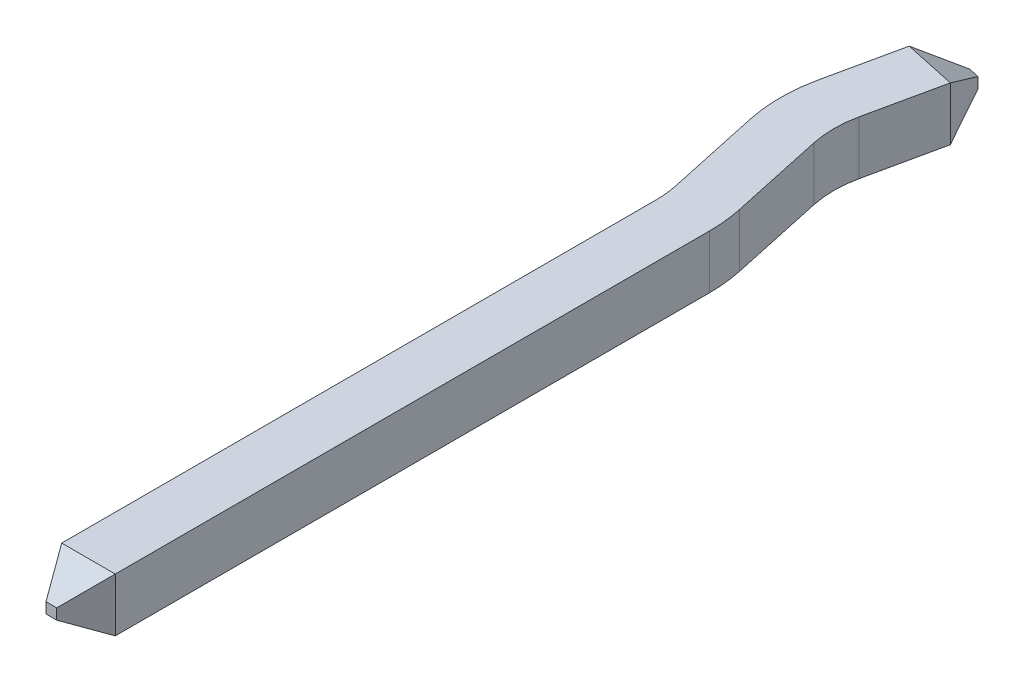
ISO-10303-21;
HEADER;
FILE_DESCRIPTION(('STEP AP214'),'2;1');
FILE_NAME('part.step','',(''),(''),'','','');
FILE_SCHEMA(('AUTOMOTIVE_DESIGN { 1 0 10303 214 1 1 1 1 }'));
ENDSEC;
DATA;
#1=APPLICATION_CONTEXT('core data for automotive mechanical design processes');
#2=APPLICATION_PROTOCOL_DEFINITION('international standard','automotive_design',2000,#1);
#3=PRODUCT_CONTEXT('',#1,'mechanical');
#4=PRODUCT('Part','Part','',(#3));
#5=PRODUCT_RELATED_PRODUCT_CATEGORY('part','',(#4));
#6=PRODUCT_DEFINITION_FORMATION('','',#4);
#7=PRODUCT_DEFINITION_CONTEXT('part definition',#1,'design');
#8=PRODUCT_DEFINITION('design','',#6,#7);
#9=PRODUCT_DEFINITION_SHAPE('','',#8);
#10=(LENGTH_UNIT() NAMED_UNIT(*) SI_UNIT(.MILLI.,.METRE.));
#11=(NAMED_UNIT(*) PLANE_ANGLE_UNIT() SI_UNIT($,.RADIAN.));
#12=(NAMED_UNIT(*) SI_UNIT($,.STERADIAN.) SOLID_ANGLE_UNIT());
#13=UNCERTAINTY_MEASURE_WITH_UNIT(LENGTH_MEASURE(1.E-05),#10,'distance_accuracy_value','');
#14=(GEOMETRIC_REPRESENTATION_CONTEXT(3) GLOBAL_UNCERTAINTY_ASSIGNED_CONTEXT((#13)) GLOBAL_UNIT_ASSIGNED_CONTEXT((#10,
#11,#12)) REPRESENTATION_CONTEXT('',''));
#15=CARTESIAN_POINT('',(0.,0.,0.));
#16=DIRECTION('',(0.,0.,1.));
#17=DIRECTION('',(1.,0.,0.));
#18=AXIS2_PLACEMENT_3D('',#15,#16,#17);
#19=CARTESIAN_POINT('',(-0.3,0.25,6.05));
#20=DIRECTION('',(-0.866025403784329,0.,0.50000000000019));
#21=DIRECTION('',(0.,1.,0.));
#22=AXIS2_PLACEMENT_3D('',#19,#20,#21);
#23=PLANE('',#22);
#24=DIRECTION('',(0.44721359550015,-0.44721359550015,0.774596669241261));
#25=VECTOR('',#24,1.);
#26=CARTESIAN_POINT('',(-0.24,-0.01,6.153923048454));
#27=LINE('',#26,#25);
#28=CARTESIAN_POINT('',(-0.5,0.25,5.703589838486));
#29=VERTEX_POINT('',#28);
#30=CARTESIAN_POINT('',(-0.3,0.05,6.05));
#31=VERTEX_POINT('',#30);
#32=EDGE_CURVE('E28',#29,#31,#27,.T.);
#33=ORIENTED_EDGE('',*,*,#32,.F.);
#34=DIRECTION('',(0.,1.,0.));
#35=VECTOR('',#34,1.);
#36=CARTESIAN_POINT('',(-0.5,0.25,5.703589838486));
#37=LINE('',#36,#35);
#38=CARTESIAN_POINT('',(-0.5,-0.25,5.703589838486));
#39=VERTEX_POINT('',#38);
#40=EDGE_CURVE('E209',#39,#29,#37,.T.);
#41=ORIENTED_EDGE('',*,*,#40,.F.);
#42=DIRECTION('',(0.44721359550015,0.44721359550015,0.774596669241261));
#43=VECTOR('',#42,1.);
#44=CARTESIAN_POINT('',(-0.4,-0.15,5.876794919243));
#45=LINE('',#44,#43);
#46=CARTESIAN_POINT('',(-0.3,-0.05,6.05));
#47=VERTEX_POINT('',#46);
#48=EDGE_CURVE('E11',#39,#47,#45,.T.);
#49=ORIENTED_EDGE('',*,*,#48,.T.);
#50=DIRECTION('',(0.,1.,0.));
#51=VECTOR('',#50,1.);
#52=CARTESIAN_POINT('',(-0.3,0.25,6.05));
#53=LINE('',#52,#51);
#54=EDGE_CURVE('E239',#47,#31,#53,.T.);
#55=ORIENTED_EDGE('',*,*,#54,.T.);
#56=EDGE_LOOP('',(#33,#41,#49,#55));
#57=FACE_BOUND('',#56,.T.);
#58=ADVANCED_FACE('F17',(#57),#23,.T.);
#59=CARTESIAN_POINT('',(0.,-0.25,5.703589838486));
#60=DIRECTION('',(0.,0.866025403784329,-0.50000000000019));
#61=DIRECTION('',(-1.,0.,0.));
#62=AXIS2_PLACEMENT_3D('',#59,#60,#61);
#63=PLANE('',#62);
#64=DIRECTION('',(-0.44721359550015,0.44721359550015,0.774596669241261));
#65=VECTOR('',#64,1.);
#66=CARTESIAN_POINT('',(0.,-0.25,5.703589838486));
#67=LINE('',#66,#65);
#68=CARTESIAN_POINT('',(0.,-0.25,5.703589838486));
#69=VERTEX_POINT('',#68);
#70=CARTESIAN_POINT('',(-0.2,-0.05,6.05));
#71=VERTEX_POINT('',#70);
#72=EDGE_CURVE('E42',#69,#71,#67,.T.);
#73=ORIENTED_EDGE('',*,*,#72,.T.);
#74=DIRECTION('',(-1.,0.,0.));
#75=VECTOR('',#74,1.);
#76=CARTESIAN_POINT('',(0.,-0.05,6.05));
#77=LINE('',#76,#75);
#78=EDGE_CURVE('E260',#71,#47,#77,.T.);
#79=ORIENTED_EDGE('',*,*,#78,.T.);
#80=ORIENTED_EDGE('',*,*,#48,.F.);
#81=DIRECTION('',(1.,0.,0.));
#82=VECTOR('',#81,1.);
#83=CARTESIAN_POINT('',(0.,-0.25,5.703589838486));
#84=LINE('',#83,#82);
#85=EDGE_CURVE('E246',#39,#69,#84,.T.);
#86=ORIENTED_EDGE('',*,*,#85,.T.);
#87=EDGE_LOOP('',(#73,#79,#80,#86));
#88=FACE_BOUND('',#87,.T.);
#89=ADVANCED_FACE('F395',(#88),#63,.F.);
#90=CARTESIAN_POINT('',(0.,0.05,6.05));
#91=DIRECTION('',(0.,0.866025403784329,0.50000000000019));
#92=DIRECTION('',(1.,0.,0.));
#93=AXIS2_PLACEMENT_3D('',#90,#91,#92);
#94=PLANE('',#93);
#95=DIRECTION('',(0.44721359550015,0.44721359550015,-0.774596669241261));
#96=VECTOR('',#95,1.);
#97=CARTESIAN_POINT('',(0.,0.25,5.703589838486));
#98=LINE('',#97,#96);
#99=CARTESIAN_POINT('',(-0.2,0.05,6.05));
#100=VERTEX_POINT('',#99);
#101=CARTESIAN_POINT('',(0.,0.25,5.703589838486));
#102=VERTEX_POINT('',#101);
#103=EDGE_CURVE('E228',#100,#102,#98,.T.);
#104=ORIENTED_EDGE('',*,*,#103,.T.);
#105=DIRECTION('',(1.,0.,0.));
#106=VECTOR('',#105,1.);
#107=CARTESIAN_POINT('',(-0.27,0.25,5.703589838486));
#108=LINE('',#107,#106);
#109=EDGE_CURVE('E302',#29,#102,#108,.T.);
#110=ORIENTED_EDGE('',*,*,#109,.F.);
#111=ORIENTED_EDGE('',*,*,#32,.T.);
#112=DIRECTION('',(1.,0.,0.));
#113=VECTOR('',#112,1.);
#114=CARTESIAN_POINT('',(0.,0.05,6.05));
#115=LINE('',#114,#113);
#116=EDGE_CURVE('E236',#31,#100,#115,.T.);
#117=ORIENTED_EDGE('',*,*,#116,.T.);
#118=EDGE_LOOP('',(#104,#110,#111,#117));
#119=FACE_BOUND('',#118,.T.);
#120=ADVANCED_FACE('F391',(#119),#94,.T.);
#121=CARTESIAN_POINT('',(0.,0.25,5.703589838486));
#122=DIRECTION('',(-0.866025403784329,0.,-0.50000000000019));
#123=DIRECTION('',(-0.50000000000019,0.,0.866025403784329));
#124=AXIS2_PLACEMENT_3D('',#121,#122,#123);
#125=PLANE('',#124);
#126=ORIENTED_EDGE('',*,*,#72,.F.);
#127=DIRECTION('',(0.,-1.,0.));
#128=VECTOR('',#127,1.);
#129=CARTESIAN_POINT('',(0.,-0.25,5.703589838486));
#130=LINE('',#129,#128);
#131=EDGE_CURVE('E208',#102,#69,#130,.T.);
#132=ORIENTED_EDGE('',*,*,#131,.F.);
#133=ORIENTED_EDGE('',*,*,#103,.F.);
#134=DIRECTION('',(0.,-1.,0.));
#135=VECTOR('',#134,1.);
#136=CARTESIAN_POINT('',(-0.2,0.25,6.05));
#137=LINE('',#136,#135);
#138=EDGE_CURVE('E214',#100,#71,#137,.T.);
#139=ORIENTED_EDGE('',*,*,#138,.T.);
#140=EDGE_LOOP('',(#126,#132,#133,#139));
#141=FACE_BOUND('',#140,.T.);
#142=ADVANCED_FACE('F382',(#141),#125,.F.);
#143=CARTESIAN_POINT('',(-0.195491559873,0.25,-2.542226176933));
#144=DIRECTION('',(0.952068727709821,0.,-0.305884190040943));
#145=DIRECTION('',(0.,-1.,0.));
#146=AXIS2_PLACEMENT_3D('',#143,#144,#145);
#147=PLANE('',#146);
#148=DIRECTION('',(0.273591136870049,0.44721359550008,0.851556157764152));
#149=VECTOR('',#148,1.);
#150=CARTESIAN_POINT('',(-0.07313788385667,0.25,-2.161398685849));
#151=LINE('',#150,#149);
#152=CARTESIAN_POINT('',(-0.195491559873,0.05,-2.542226176933));
#153=VERTEX_POINT('',#152);
#154=CARTESIAN_POINT('',(-0.07313788385667,0.25,-2.161398685849));
#155=VERTEX_POINT('',#154);
#156=EDGE_CURVE('E227',#153,#155,#151,.T.);
#157=ORIENTED_EDGE('',*,*,#156,.T.);
#158=DIRECTION('',(0.,1.,0.));
#159=VECTOR('',#158,1.);
#160=CARTESIAN_POINT('',(-0.07313788385667,0.25,-2.161398685849));
#161=LINE('',#160,#159);
#162=CARTESIAN_POINT('',(-0.07313788385668,-0.25,-2.161398685849));
#163=VERTEX_POINT('',#162);
#164=EDGE_CURVE('E198',#163,#155,#161,.T.);
#165=ORIENTED_EDGE('',*,*,#164,.F.);
#166=DIRECTION('',(0.273591136870049,-0.44721359550008,0.851556157764152));
#167=VECTOR('',#166,1.);
#168=CARTESIAN_POINT('',(-0.17102082467,-0.09,-2.466060678716));
#169=LINE('',#168,#167);
#170=CARTESIAN_POINT('',(-0.195491559873,-0.05,-2.542226176933));
#171=VERTEX_POINT('',#170);
#172=EDGE_CURVE('E224',#171,#163,#169,.T.);
#173=ORIENTED_EDGE('',*,*,#172,.F.);
#174=DIRECTION('',(0.,-1.,0.));
#175=VECTOR('',#174,1.);
#176=CARTESIAN_POINT('',(-0.195491559873,-0.25,-2.542226176933));
#177=LINE('',#176,#175);
#178=EDGE_CURVE('E267',#153,#171,#177,.T.);
#179=ORIENTED_EDGE('',*,*,#178,.F.);
#180=EDGE_LOOP('',(#157,#165,#173,#179));
#181=FACE_BOUND('',#180,.T.);
#182=ADVANCED_FACE('F409',(#181),#147,.T.);
#183=CARTESIAN_POINT('',(0.,-0.05,-2.5));
#184=DIRECTION('',(0.105565442332034,-0.866025403784283,-0.48872889968316));
#185=DIRECTION('',(0.,0.49147508660748,-0.870891634616024));
#186=AXIS2_PLACEMENT_3D('',#183,#184,#185);
#187=PLANE('',#186);
#188=DIRECTION('',(-0.600673696937871,-0.447213595499904,0.662714953661858));
#189=VECTOR('',#188,1.);
#190=CARTESIAN_POINT('',(-0.212648506691,0.009999999999999,-2.652251806565));
#191=LINE('',#190,#189);
#192=CARTESIAN_POINT('',(-0.29323733981,-0.05,-2.563339265399));
#193=VERTEX_POINT('',#192);
#194=CARTESIAN_POINT('',(-0.56186678354,-0.25,-2.26696412818));
#195=VERTEX_POINT('',#194);
#196=EDGE_CURVE('E279',#193,#195,#191,.T.);
#197=ORIENTED_EDGE('',*,*,#196,.F.);
#198=DIRECTION('',(-0.977457799365998,0.,-0.211130884663));
#199=VECTOR('',#198,1.);
#200=CARTESIAN_POINT('',(0.,-0.05,-2.5));
#201=LINE('',#200,#199);
#202=EDGE_CURVE('E286',#171,#193,#201,.T.);
#203=ORIENTED_EDGE('',*,*,#202,.F.);
#204=ORIENTED_EDGE('',*,*,#172,.T.);
#205=DIRECTION('',(-0.977457799365998,0.,-0.211130884663));
#206=VECTOR('',#205,1.);
#207=CARTESIAN_POINT('',(1.691338696796,-0.25,-1.780271744428));
#208=LINE('',#207,#206);
#209=EDGE_CURVE('E194',#163,#195,#208,.T.);
#210=ORIENTED_EDGE('',*,*,#209,.T.);
#211=EDGE_LOOP('',(#197,#203,#204,#210));
#212=FACE_BOUND('',#211,.T.);
#213=ADVANCED_FACE('F412',(#212),#187,.T.);
#214=CARTESIAN_POINT('',(-0.07313788385667,0.25,-2.161398685849));
#215=DIRECTION('',(-0.105565442332034,-0.866025403784283,0.48872889968316));
#216=DIRECTION('',(-0.992652406325069,0.121000827340356,0.));
#217=AXIS2_PLACEMENT_3D('',#214,#215,#216);
#218=PLANE('',#217);
#219=DIRECTION('',(-0.600673696937871,0.447213595499904,0.662714953661858));
#220=VECTOR('',#219,1.);
#221=CARTESIAN_POINT('',(-0.427552061675,0.15,-2.41515169679));
#222=LINE('',#221,#220);
#223=CARTESIAN_POINT('',(-0.29323733981,0.05,-2.563339265399));
#224=VERTEX_POINT('',#223);
#225=CARTESIAN_POINT('',(-0.56186678354,0.25,-2.26696412818));
#226=VERTEX_POINT('',#225);
#227=EDGE_CURVE('E282',#224,#226,#222,.T.);
#228=ORIENTED_EDGE('',*,*,#227,.T.);
#229=DIRECTION('',(-0.977457799365998,0.,-0.211130884663));
#230=VECTOR('',#229,1.);
#231=CARTESIAN_POINT('',(-0.07313788385667,0.25,-2.161398685849));
#232=LINE('',#231,#230);
#233=EDGE_CURVE('E219',#155,#226,#232,.T.);
#234=ORIENTED_EDGE('',*,*,#233,.F.);
#235=ORIENTED_EDGE('',*,*,#156,.F.);
#236=DIRECTION('',(0.977457799365998,0.,0.211130884663));
#237=VECTOR('',#236,1.);
#238=CARTESIAN_POINT('',(0.,0.05,-2.5));
#239=LINE('',#238,#237);
#240=EDGE_CURVE('E263',#224,#153,#239,.T.);
#241=ORIENTED_EDGE('',*,*,#240,.F.);
#242=EDGE_LOOP('',(#228,#234,#235,#241));
#243=FACE_BOUND('',#242,.T.);
#244=ADVANCED_FACE('F424',(#243),#218,.F.);
#245=CARTESIAN_POINT('',(-0.56186678354,0.25,-2.26696412818));
#246=DIRECTION('',(0.740937843046649,0.,0.671573609324682));
#247=DIRECTION('',(0.,-1.,0.));
#248=AXIS2_PLACEMENT_3D('',#245,#246,#247);
#249=PLANE('',#248);
#250=ORIENTED_EDGE('',*,*,#196,.T.);
#251=DIRECTION('',(0.,-1.,0.));
#252=VECTOR('',#251,1.);
#253=CARTESIAN_POINT('',(-0.56186678354,0.25,-2.26696412818));
#254=LINE('',#253,#252);
#255=EDGE_CURVE('E272',#226,#195,#254,.T.);
#256=ORIENTED_EDGE('',*,*,#255,.F.);
#257=ORIENTED_EDGE('',*,*,#227,.F.);
#258=DIRECTION('',(0.,1.,0.));
#259=VECTOR('',#258,1.);
#260=CARTESIAN_POINT('',(-0.29323733981,0.25,-2.563339265399));
#261=LINE('',#260,#259);
#262=EDGE_CURVE('E268',#193,#224,#261,.T.);
#263=ORIENTED_EDGE('',*,*,#262,.F.);
#264=EDGE_LOOP('',(#250,#256,#257,#263));
#265=FACE_BOUND('',#264,.T.);
#266=ADVANCED_FACE('F421',(#265),#249,.F.);
#267=CARTESIAN_POINT('',(-0.27,0.25,-1.25));
#268=DIRECTION('',(-0.977457799365998,0.,-0.211130884663));
#269=DIRECTION('',(-0.211130884663,0.,0.977457799365998));
#270=AXIS2_PLACEMENT_3D('',#267,#268,#269);
#271=PLANE('',#270);
#272=DIRECTION('',(0.211130884663,0.,-0.977457799365998));
#273=VECTOR('',#272,1.);
#274=CARTESIAN_POINT('',(-0.27,-0.25,-1.25));
#275=LINE('',#274,#273);
#276=CARTESIAN_POINT('',(-0.224395728913,-0.25,-1.461130884663));
#277=VERTEX_POINT('',#276);
#278=EDGE_CURVE('E188',#277,#163,#275,.T.);
#279=ORIENTED_EDGE('',*,*,#278,.T.);
#280=ORIENTED_EDGE('',*,*,#164,.T.);
#281=DIRECTION('',(0.211130884663,0.,-0.977457799365998));
#282=VECTOR('',#281,1.);
#283=CARTESIAN_POINT('',(-0.27,0.25,-1.25));
#284=LINE('',#283,#282);
#285=CARTESIAN_POINT('',(-0.224395728913,0.25,-1.461130884663));
#286=VERTEX_POINT('',#285);
#287=EDGE_CURVE('E215',#286,#155,#284,.T.);
#288=ORIENTED_EDGE('',*,*,#287,.F.);
#289=DIRECTION('',(0.,-1.,0.));
#290=VECTOR('',#289,1.);
#291=CARTESIAN_POINT('',(-0.224395728913,0.25,-1.461130884663));
#292=LINE('',#291,#290);
#293=EDGE_CURVE('E174',#286,#277,#292,.T.);
#294=ORIENTED_EDGE('',*,*,#293,.T.);
#295=EDGE_LOOP('',(#279,#280,#288,#294));
#296=FACE_BOUND('',#295,.T.);
#297=ADVANCED_FACE('F423',(#296),#271,.F.);
#298=CARTESIAN_POINT('',(0.753062070453,0.25,-1.25));
#299=DIRECTION('',(0.,-1.,0.));
#300=DIRECTION('',(0.,0.,-1.));
#301=AXIS2_PLACEMENT_3D('',#298,#299,#300);
#302=CYLINDRICAL_SURFACE('',#301,1.);
#303=CARTESIAN_POINT('',(0.753062070453,-0.25,-1.25));
#304=DIRECTION('',(0.,1.,0.));
#305=DIRECTION('',(0.,0.,1.));
#306=AXIS2_PLACEMENT_3D('',#303,#304,#305);
#307=CIRCLE('',#306,1.);
#308=CARTESIAN_POINT('',(-0.224395728913,-0.25,-1.038869115337));
#309=VERTEX_POINT('',#308);
#310=EDGE_CURVE('E168',#277,#309,#307,.T.);
#311=ORIENTED_EDGE('',*,*,#310,.F.);
#312=ORIENTED_EDGE('',*,*,#293,.F.);
#313=CARTESIAN_POINT('',(0.753062070453,0.25,-1.25));
#314=DIRECTION('',(0.,1.,0.));
#315=DIRECTION('',(0.,0.,1.));
#316=AXIS2_PLACEMENT_3D('',#313,#314,#315);
#317=CIRCLE('',#316,1.);
#318=CARTESIAN_POINT('',(-0.224395728913,0.25,-1.038869115337));
#319=VERTEX_POINT('',#318);
#320=EDGE_CURVE('E171',#286,#319,#317,.T.);
#321=ORIENTED_EDGE('',*,*,#320,.T.);
#322=DIRECTION('',(0.,-1.,0.));
#323=VECTOR('',#322,1.);
#324=CARTESIAN_POINT('',(-0.224395728913,0.25,-1.038869115337));
#325=LINE('',#324,#323);
#326=EDGE_CURVE('E92',#319,#309,#325,.T.);
#327=ORIENTED_EDGE('',*,*,#326,.T.);
#328=EDGE_LOOP('',(#311,#312,#321,#327));
#329=FACE_BOUND('',#328,.T.);
#330=ADVANCED_FACE('F166',(#329),#302,.F.);
#331=CARTESIAN_POINT('',(0.,0.25,0.));
#332=DIRECTION('',(-0.977457799365998,0.,0.211130884663));
#333=DIRECTION('',(0.,1.,0.));
#334=AXIS2_PLACEMENT_3D('',#331,#332,#333);
#335=PLANE('',#334);
#336=DIRECTION('',(-0.211130884663,0.,-0.977457799365998));
#337=VECTOR('',#336,1.);
#338=CARTESIAN_POINT('',(0.,-0.25,0.));
#339=LINE('',#338,#337);
#340=CARTESIAN_POINT('',(-0.03381330095102,-0.25,-0.156543059958));
#341=VERTEX_POINT('',#340);
#342=EDGE_CURVE('E177',#341,#309,#339,.T.);
#343=ORIENTED_EDGE('',*,*,#342,.T.);
#344=ORIENTED_EDGE('',*,*,#326,.F.);
#345=DIRECTION('',(-0.211130884663,0.,-0.977457799365998));
#346=VECTOR('',#345,1.);
#347=CARTESIAN_POINT('',(0.,0.25,0.));
#348=LINE('',#347,#346);
#349=CARTESIAN_POINT('',(-0.03381330095102,0.25,-0.156543059958));
#350=VERTEX_POINT('',#349);
#351=EDGE_CURVE('E295',#350,#319,#348,.T.);
#352=ORIENTED_EDGE('',*,*,#351,.F.);
#353=DIRECTION('',(0.,-1.,0.));
#354=VECTOR('',#353,1.);
#355=CARTESIAN_POINT('',(-0.03381330095102,0.25,-0.156543059958));
#356=LINE('',#355,#354);
#357=EDGE_CURVE('E108',#350,#341,#356,.T.);
#358=ORIENTED_EDGE('',*,*,#357,.T.);
#359=EDGE_LOOP('',(#343,#344,#352,#358));
#360=FACE_BOUND('',#359,.T.);
#361=ADVANCED_FACE('F178',(#360),#335,.F.);
#362=CARTESIAN_POINT('',(-1.5,0.25,0.160153267036));
#363=DIRECTION('',(0.,-1.,0.));
#364=DIRECTION('',(0.,0.,-1.));
#365=AXIS2_PLACEMENT_3D('',#362,#363,#364);
#366=CYLINDRICAL_SURFACE('',#365,1.5);
#367=CARTESIAN_POINT('',(-1.5,-0.25,0.160153267036));
#368=DIRECTION('',(0.,-1.,0.));
#369=DIRECTION('',(0.,0.,-1.));
#370=AXIS2_PLACEMENT_3D('',#367,#368,#369);
#371=CIRCLE('',#370,1.5);
#372=CARTESIAN_POINT('',(0.,-0.25,0.160153267036));
#373=VERTEX_POINT('',#372);
#374=EDGE_CURVE('E182',#341,#373,#371,.T.);
#375=ORIENTED_EDGE('',*,*,#374,.F.);
#376=ORIENTED_EDGE('',*,*,#357,.F.);
#377=CARTESIAN_POINT('',(-1.5,0.25,0.160153267036));
#378=DIRECTION('',(0.,-1.,0.));
#379=DIRECTION('',(0.,0.,-1.));
#380=AXIS2_PLACEMENT_3D('',#377,#378,#379);
#381=CIRCLE('',#380,1.5);
#382=CARTESIAN_POINT('',(0.,0.25,0.160153267036));
#383=VERTEX_POINT('',#382);
#384=EDGE_CURVE('E21',#350,#383,#381,.T.);
#385=ORIENTED_EDGE('',*,*,#384,.T.);
#386=DIRECTION('',(0.,-1.,0.));
#387=VECTOR('',#386,1.);
#388=CARTESIAN_POINT('',(0.,0.25,0.160153267036));
#389=LINE('',#388,#387);
#390=EDGE_CURVE('E205',#383,#373,#389,.T.);
#391=ORIENTED_EDGE('',*,*,#390,.T.);
#392=EDGE_LOOP('',(#375,#376,#385,#391));
#393=FACE_BOUND('',#392,.T.);
#394=ADVANCED_FACE('F477',(#393),#366,.T.);
#395=CARTESIAN_POINT('',(0.,0.25,6.05));
#396=DIRECTION('',(-1.,0.,0.));
#397=DIRECTION('',(0.,1.,0.));
#398=AXIS2_PLACEMENT_3D('',#395,#396,#397);
#399=PLANE('',#398);
#400=DIRECTION('',(0.,0.,-1.));
#401=VECTOR('',#400,1.);
#402=CARTESIAN_POINT('',(0.,0.25,6.05));
#403=LINE('',#402,#401);
#404=EDGE_CURVE('E315',#102,#383,#403,.T.);
#405=ORIENTED_EDGE('',*,*,#404,.F.);
#406=ORIENTED_EDGE('',*,*,#131,.T.);
#407=DIRECTION('',(0.,0.,-1.));
#408=VECTOR('',#407,1.);
#409=CARTESIAN_POINT('',(0.,-0.25,6.05));
#410=LINE('',#409,#408);
#411=EDGE_CURVE('E250',#69,#373,#410,.T.);
#412=ORIENTED_EDGE('',*,*,#411,.T.);
#413=ORIENTED_EDGE('',*,*,#390,.F.);
#414=EDGE_LOOP('',(#405,#406,#412,#413));
#415=FACE_BOUND('',#414,.T.);
#416=ADVANCED_FACE('F407',(#415),#399,.F.);
#417=CARTESIAN_POINT('',(-0.758728899683,0.25,-1.355565442332));
#418=DIRECTION('',(-0.977457799365998,0.,-0.211130884663));
#419=DIRECTION('',(-0.211130884663,0.,0.977457799365998));
#420=AXIS2_PLACEMENT_3D('',#417,#418,#419);
#421=PLANE('',#420);
#422=DIRECTION('',(-0.211130884663,0.,0.977457799365998));
#423=VECTOR('',#422,1.);
#424=CARTESIAN_POINT('',(-0.758728899683,0.25,-1.355565442332));
#425=LINE('',#424,#423);
#426=CARTESIAN_POINT('',(-0.713124628596,0.25,-1.566696326995));
#427=VERTEX_POINT('',#426);
#428=EDGE_CURVE('E223',#226,#427,#425,.T.);
#429=ORIENTED_EDGE('',*,*,#428,.F.);
#430=ORIENTED_EDGE('',*,*,#255,.T.);
#431=DIRECTION('',(-0.211130884663,0.,0.977457799365998));
#432=VECTOR('',#431,1.);
#433=CARTESIAN_POINT('',(-0.758728899683,-0.25,-1.355565442332));
#434=LINE('',#433,#432);
#435=CARTESIAN_POINT('',(-0.713124628596,-0.25,-1.566696326995));
#436=VERTEX_POINT('',#435);
#437=EDGE_CURVE('E245',#195,#436,#434,.T.);
#438=ORIENTED_EDGE('',*,*,#437,.T.);
#439=DIRECTION('',(0.,-1.,0.));
#440=VECTOR('',#439,1.);
#441=CARTESIAN_POINT('',(-0.713124628596,0.25,-1.566696326995));
#442=LINE('',#441,#440);
#443=EDGE_CURVE('E332',#427,#436,#442,.T.);
#444=ORIENTED_EDGE('',*,*,#443,.F.);
#445=EDGE_LOOP('',(#429,#430,#438,#444));
#446=FACE_BOUND('',#445,.T.);
#447=ADVANCED_FACE('F367',(#446),#421,.T.);
#448=CARTESIAN_POINT('',(0.753062070453,0.25,-1.25));
#449=DIRECTION('',(0.,-1.,0.));
#450=DIRECTION('',(0.,0.,-1.));
#451=AXIS2_PLACEMENT_3D('',#448,#449,#450);
#452=CYLINDRICAL_SURFACE('',#451,1.5);
#453=CARTESIAN_POINT('',(0.753062070453,-0.25,-1.25));
#454=DIRECTION('',(0.,-1.,0.));
#455=DIRECTION('',(0.,0.,-1.));
#456=AXIS2_PLACEMENT_3D('',#453,#454,#455);
#457=CIRCLE('',#456,1.5);
#458=CARTESIAN_POINT('',(-0.713124628596,-0.25,-0.933303673005));
#459=VERTEX_POINT('',#458);
#460=EDGE_CURVE('E240',#459,#436,#457,.T.);
#461=ORIENTED_EDGE('',*,*,#460,.F.);
#462=DIRECTION('',(0.,1.,0.));
#463=VECTOR('',#462,1.);
#464=CARTESIAN_POINT('',(-0.713124628596,0.25,-0.933303673005));
#465=LINE('',#464,#463);
#466=CARTESIAN_POINT('',(-0.713124628596,0.25,-0.933303673005));
#467=VERTEX_POINT('',#466);
#468=EDGE_CURVE('E253',#459,#467,#465,.T.);
#469=ORIENTED_EDGE('',*,*,#468,.T.);
#470=CARTESIAN_POINT('',(0.753062070453,0.25,-1.25));
#471=DIRECTION('',(0.,-1.,0.));
#472=DIRECTION('',(0.,0.,-1.));
#473=AXIS2_PLACEMENT_3D('',#470,#471,#472);
#474=CIRCLE('',#473,1.5);
#475=EDGE_CURVE('E204',#467,#427,#474,.T.);
#476=ORIENTED_EDGE('',*,*,#475,.T.);
#477=ORIENTED_EDGE('',*,*,#443,.T.);
#478=EDGE_LOOP('',(#461,#469,#476,#477));
#479=FACE_BOUND('',#478,.T.);
#480=ADVANCED_FACE('F357',(#479),#452,.T.);
#481=CARTESIAN_POINT('',(-0.488728899683,0.25,0.105565442332));
#482=DIRECTION('',(-0.977457799365998,0.,0.211130884663));
#483=DIRECTION('',(0.,1.,0.));
#484=AXIS2_PLACEMENT_3D('',#481,#482,#483);
#485=PLANE('',#484);
#486=DIRECTION('',(0.211130884663,0.,0.977457799365998));
#487=VECTOR('',#486,1.);
#488=CARTESIAN_POINT('',(-0.488728899683,-0.25,0.105565442332));
#489=LINE('',#488,#487);
#490=CARTESIAN_POINT('',(-0.522542200634,-0.25,-0.05097761762691));
#491=VERTEX_POINT('',#490);
#492=EDGE_CURVE('E322',#459,#491,#489,.T.);
#493=ORIENTED_EDGE('',*,*,#492,.T.);
#494=DIRECTION('',(0.,-1.,0.));
#495=VECTOR('',#494,1.);
#496=CARTESIAN_POINT('',(-0.522542200634,0.25,-0.05097761762691));
#497=LINE('',#496,#495);
#498=CARTESIAN_POINT('',(-0.522542200634,0.25,-0.05097761762691));
#499=VERTEX_POINT('',#498);
#500=EDGE_CURVE('E251',#499,#491,#497,.T.);
#501=ORIENTED_EDGE('',*,*,#500,.F.);
#502=DIRECTION('',(0.211130884663,0.,0.977457799365998));
#503=VECTOR('',#502,1.);
#504=CARTESIAN_POINT('',(-0.488728899683,0.25,0.105565442332));
#505=LINE('',#504,#503);
#506=EDGE_CURVE('E199',#467,#499,#505,.T.);
#507=ORIENTED_EDGE('',*,*,#506,.F.);
#508=ORIENTED_EDGE('',*,*,#468,.F.);
#509=EDGE_LOOP('',(#493,#501,#507,#508));
#510=FACE_BOUND('',#509,.T.);
#511=ADVANCED_FACE('F19',(#510),#485,.T.);
#512=CARTESIAN_POINT('',(-1.5,0.25,0.160153267036));
#513=DIRECTION('',(0.,-1.,0.));
#514=DIRECTION('',(0.,0.,-1.));
#515=AXIS2_PLACEMENT_3D('',#512,#513,#514);
#516=CYLINDRICAL_SURFACE('',#515,1.);
#517=CARTESIAN_POINT('',(-1.5,-0.25,0.160153267036));
#518=DIRECTION('',(0.,-1.,0.));
#519=DIRECTION('',(0.,0.,-1.));
#520=AXIS2_PLACEMENT_3D('',#517,#518,#519);
#521=CIRCLE('',#520,1.);
#522=CARTESIAN_POINT('',(-0.5,-0.25,0.160153267036));
#523=VERTEX_POINT('',#522);
#524=EDGE_CURVE('E326',#491,#523,#521,.T.);
#525=ORIENTED_EDGE('',*,*,#524,.T.);
#526=DIRECTION('',(0.,1.,0.));
#527=VECTOR('',#526,1.);
#528=CARTESIAN_POINT('',(-0.5,0.25,0.160153267036));
#529=LINE('',#528,#527);
#530=CARTESIAN_POINT('',(-0.5,0.25,0.160153267036));
#531=VERTEX_POINT('',#530);
#532=EDGE_CURVE('E213',#523,#531,#529,.T.);
#533=ORIENTED_EDGE('',*,*,#532,.T.);
#534=CARTESIAN_POINT('',(-1.5,0.25,0.160153267036));
#535=DIRECTION('',(0.,-1.,0.));
#536=DIRECTION('',(0.,0.,-1.));
#537=AXIS2_PLACEMENT_3D('',#534,#535,#536);
#538=CIRCLE('',#537,1.);
#539=EDGE_CURVE('E203',#499,#531,#538,.T.);
#540=ORIENTED_EDGE('',*,*,#539,.F.);
#541=ORIENTED_EDGE('',*,*,#500,.T.);
#542=EDGE_LOOP('',(#525,#533,#540,#541));
#543=FACE_BOUND('',#542,.T.);
#544=ADVANCED_FACE('F419',(#543),#516,.F.);
#545=CARTESIAN_POINT('',(-0.5,0.25,6.05));
#546=DIRECTION('',(-1.,0.,0.));
#547=DIRECTION('',(0.,1.,0.));
#548=AXIS2_PLACEMENT_3D('',#545,#546,#547);
#549=PLANE('',#548);
#550=DIRECTION('',(0.,0.,1.));
#551=VECTOR('',#550,1.);
#552=CARTESIAN_POINT('',(-0.5,-0.25,6.05));
#553=LINE('',#552,#551);
#554=EDGE_CURVE('E249',#523,#39,#553,.T.);
#555=ORIENTED_EDGE('',*,*,#554,.T.);
#556=ORIENTED_EDGE('',*,*,#40,.T.);
#557=DIRECTION('',(0.,0.,1.));
#558=VECTOR('',#557,1.);
#559=CARTESIAN_POINT('',(-0.5,0.25,6.05));
#560=LINE('',#559,#558);
#561=EDGE_CURVE('E298',#531,#29,#560,.T.);
#562=ORIENTED_EDGE('',*,*,#561,.F.);
#563=ORIENTED_EDGE('',*,*,#532,.F.);
#564=EDGE_LOOP('',(#555,#556,#562,#563));
#565=FACE_BOUND('',#564,.T.);
#566=ADVANCED_FACE('F417',(#565),#549,.T.);
#567=CARTESIAN_POINT('',(0.,0.25,6.05));
#568=DIRECTION('',(0.,0.,-1.));
#569=DIRECTION('',(-1.,0.,0.));
#570=AXIS2_PLACEMENT_3D('',#567,#568,#569);
#571=PLANE('',#570);
#572=ORIENTED_EDGE('',*,*,#116,.F.);
#573=ORIENTED_EDGE('',*,*,#54,.F.);
#574=ORIENTED_EDGE('',*,*,#78,.F.);
#575=ORIENTED_EDGE('',*,*,#138,.F.);
#576=EDGE_LOOP('',(#572,#573,#574,#575));
#577=FACE_BOUND('',#576,.T.);
#578=ADVANCED_FACE('F389',(#577),#571,.F.);
#579=CARTESIAN_POINT('',(0.,-0.25,6.05));
#580=DIRECTION('',(0.,1.,0.));
#581=DIRECTION('',(1.,0.,0.));
#582=AXIS2_PLACEMENT_3D('',#579,#580,#581);
#583=PLANE('',#582);
#584=ORIENTED_EDGE('',*,*,#437,.F.);
#585=ORIENTED_EDGE('',*,*,#209,.F.);
#586=ORIENTED_EDGE('',*,*,#278,.F.);
#587=ORIENTED_EDGE('',*,*,#310,.T.);
#588=ORIENTED_EDGE('',*,*,#342,.F.);
#589=ORIENTED_EDGE('',*,*,#374,.T.);
#590=ORIENTED_EDGE('',*,*,#411,.F.);
#591=ORIENTED_EDGE('',*,*,#85,.F.);
#592=ORIENTED_EDGE('',*,*,#554,.F.);
#593=ORIENTED_EDGE('',*,*,#524,.F.);
#594=ORIENTED_EDGE('',*,*,#492,.F.);
#595=ORIENTED_EDGE('',*,*,#460,.T.);
#596=EDGE_LOOP('',(#584,#585,#586,#587,#588,#589,#590,#591,#592,#593,#594,#595));
#597=FACE_BOUND('',#596,.T.);
#598=ADVANCED_FACE('F185',(#597),#583,.F.);
#599=CARTESIAN_POINT('',(0.,0.25,-2.5));
#600=DIRECTION('',(0.211130884663,0.,-0.977457799365998));
#601=DIRECTION('',(0.,-1.,0.));
#602=AXIS2_PLACEMENT_3D('',#599,#600,#601);
#603=PLANE('',#602);
#604=ORIENTED_EDGE('',*,*,#262,.T.);
#605=ORIENTED_EDGE('',*,*,#240,.T.);
#606=ORIENTED_EDGE('',*,*,#178,.T.);
#607=ORIENTED_EDGE('',*,*,#202,.T.);
#608=EDGE_LOOP('',(#604,#605,#606,#607));
#609=FACE_BOUND('',#608,.T.);
#610=ADVANCED_FACE('F416',(#609),#603,.T.);
#611=CARTESIAN_POINT('',(-0.27,0.25,-1.25));
#612=DIRECTION('',(0.,1.,0.));
#613=DIRECTION('',(1.,0.,0.));
#614=AXIS2_PLACEMENT_3D('',#611,#612,#613);
#615=PLANE('',#614);
#616=ORIENTED_EDGE('',*,*,#287,.T.);
#617=ORIENTED_EDGE('',*,*,#233,.T.);
#618=ORIENTED_EDGE('',*,*,#428,.T.);
#619=ORIENTED_EDGE('',*,*,#475,.F.);
#620=ORIENTED_EDGE('',*,*,#506,.T.);
#621=ORIENTED_EDGE('',*,*,#539,.T.);
#622=ORIENTED_EDGE('',*,*,#561,.T.);
#623=ORIENTED_EDGE('',*,*,#109,.T.);
#624=ORIENTED_EDGE('',*,*,#404,.T.);
#625=ORIENTED_EDGE('',*,*,#384,.F.);
#626=ORIENTED_EDGE('',*,*,#351,.T.);
#627=ORIENTED_EDGE('',*,*,#320,.F.);
#628=EDGE_LOOP('',(#616,#617,#618,#619,#620,#621,#622,#623,#624,#625,#626,#627));
#629=FACE_BOUND('',#628,.T.);
#630=ADVANCED_FACE('F363',(#629),#615,.T.);
#631=CLOSED_SHELL('',(#58,#89,#120,#142,#182,#213,#244,#266,#297,#330,#361,#394,#416,#447,#480,
#511,#544,#566,#578,#598,#610,#630));
#632=MANIFOLD_SOLID_BREP('B1',#631);
#633=ADVANCED_BREP_SHAPE_REPRESENTATION('',(#18,#632),#14);
#634=SHAPE_DEFINITION_REPRESENTATION(#9,#633);
ENDSEC;
END-ISO-10303-21;
